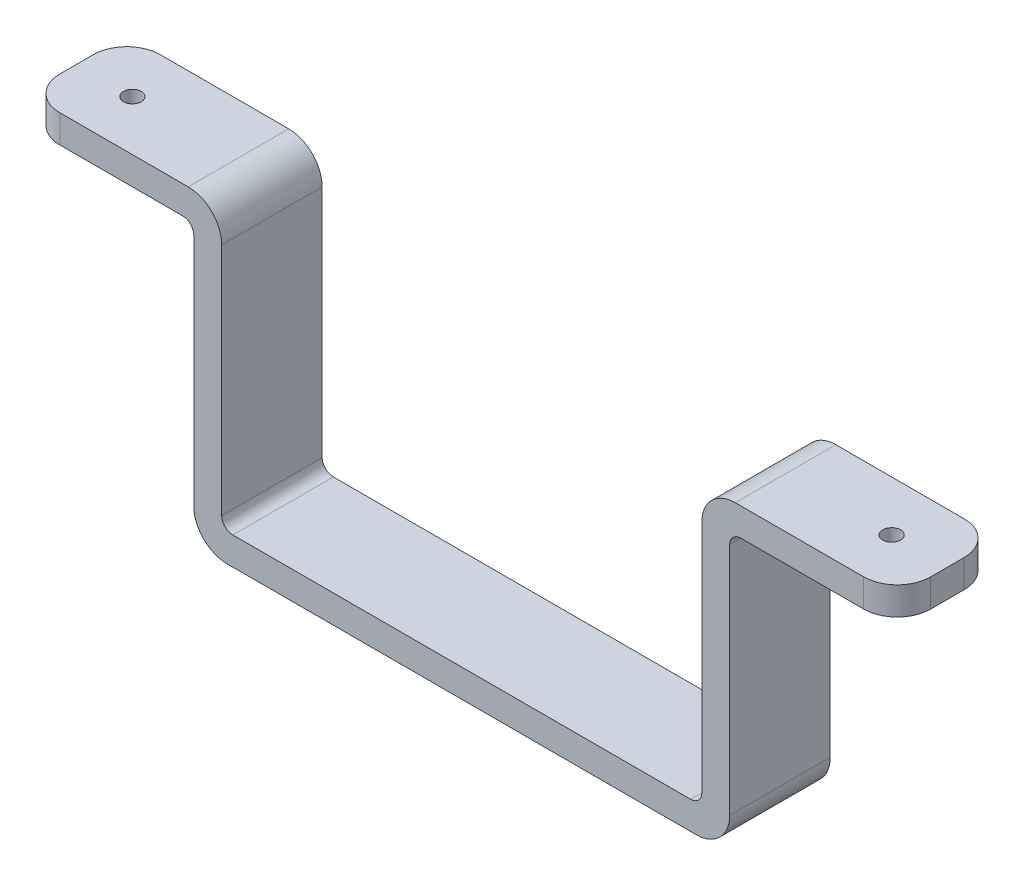
ISO-10303-21;
HEADER;
FILE_DESCRIPTION(('STEP AP214'),'2;1');
FILE_NAME('part.step','',(''),(''),'','','');
FILE_SCHEMA(('AUTOMOTIVE_DESIGN { 1 0 10303 214 1 1 1 1 }'));
ENDSEC;
DATA;
#1=APPLICATION_CONTEXT('core data for automotive mechanical design processes');
#2=APPLICATION_PROTOCOL_DEFINITION('international standard','automotive_design',2000,#1);
#3=PRODUCT_CONTEXT('',#1,'mechanical');
#4=PRODUCT('Part','Part','',(#3));
#5=PRODUCT_RELATED_PRODUCT_CATEGORY('part','',(#4));
#6=PRODUCT_DEFINITION_FORMATION('','',#4);
#7=PRODUCT_DEFINITION_CONTEXT('part definition',#1,'design');
#8=PRODUCT_DEFINITION('design','',#6,#7);
#9=PRODUCT_DEFINITION_SHAPE('','',#8);
#10=(LENGTH_UNIT() NAMED_UNIT(*) SI_UNIT(.MILLI.,.METRE.));
#11=(NAMED_UNIT(*) PLANE_ANGLE_UNIT() SI_UNIT($,.RADIAN.));
#12=(NAMED_UNIT(*) SI_UNIT($,.STERADIAN.) SOLID_ANGLE_UNIT());
#13=UNCERTAINTY_MEASURE_WITH_UNIT(LENGTH_MEASURE(1.E-05),#10,'distance_accuracy_value','');
#14=(GEOMETRIC_REPRESENTATION_CONTEXT(3) GLOBAL_UNCERTAINTY_ASSIGNED_CONTEXT((#13)) GLOBAL_UNIT_ASSIGNED_CONTEXT((#10,
#11,#12)) REPRESENTATION_CONTEXT('',''));
#15=CARTESIAN_POINT('',(0.,0.,0.));
#16=DIRECTION('',(0.,0.,1.));
#17=DIRECTION('',(1.,0.,0.));
#18=AXIS2_PLACEMENT_3D('',#15,#16,#17);
#19=CARTESIAN_POINT('',(-45.4805362921868,-17.3544151641239,9.));
#20=DIRECTION('',(0.,1.,0.));
#21=DIRECTION('',(0.,0.,1.));
#22=AXIS2_PLACEMENT_3D('',#19,#20,#21);
#23=PLANE('',#22);
#24=DIRECTION('',(1.,0.,0.));
#25=VECTOR('',#24,1.);
#26=CARTESIAN_POINT('',(-45.4805362921868,-17.3544151641239,0.));
#27=LINE('',#26,#25);
#28=CARTESIAN_POINT('',(-42.4805362921868,-17.3544151641239,0.));
#29=VERTEX_POINT('',#28);
#30=CARTESIAN_POINT('',(-0.480536292186792,-17.3544151641239,0.));
#31=VERTEX_POINT('',#30);
#32=EDGE_CURVE('E232',#29,#31,#27,.T.);
#33=ORIENTED_EDGE('',*,*,#32,.T.);
#34=DIRECTION('',(0.,0.,-1.));
#35=VECTOR('',#34,1.);
#36=CARTESIAN_POINT('',(-0.480536292186792,-17.3544151641239,9.));
#37=LINE('',#36,#35);
#38=CARTESIAN_POINT('',(-0.480536292186792,-17.3544151641239,9.));
#39=VERTEX_POINT('',#38);
#40=EDGE_CURVE('E328',#31,#39,#37,.F.);
#41=ORIENTED_EDGE('',*,*,#40,.T.);
#42=DIRECTION('',(1.,0.,0.));
#43=VECTOR('',#42,1.);
#44=CARTESIAN_POINT('',(-45.4805362921868,-17.3544151641239,9.));
#45=LINE('',#44,#43);
#46=CARTESIAN_POINT('',(-42.4805362921868,-17.3544151641239,9.));
#47=VERTEX_POINT('',#46);
#48=EDGE_CURVE('E250',#47,#39,#45,.T.);
#49=ORIENTED_EDGE('',*,*,#48,.F.);
#50=DIRECTION('',(0.,0.,-1.));
#51=VECTOR('',#50,1.);
#52=CARTESIAN_POINT('',(-42.4805362921868,-17.3544151641239,9.));
#53=LINE('',#52,#51);
#54=EDGE_CURVE('E325',#47,#29,#53,.T.);
#55=ORIENTED_EDGE('',*,*,#54,.T.);
#56=EDGE_LOOP('',(#33,#41,#49,#55));
#57=FACE_BOUND('',#56,.T.);
#58=ADVANCED_FACE('F37',(#57),#23,.F.);
#59=CARTESIAN_POINT('',(2.51946370781321,-17.3544151641239,9.));
#60=DIRECTION('',(-1.,0.,0.));
#61=DIRECTION('',(0.,0.,1.));
#62=AXIS2_PLACEMENT_3D('',#59,#60,#61);
#63=PLANE('',#62);
#64=DIRECTION('',(0.,1.,0.));
#65=VECTOR('',#64,1.);
#66=CARTESIAN_POINT('',(2.51946370781321,-17.3544151641239,9.));
#67=LINE('',#66,#65);
#68=CARTESIAN_POINT('',(2.51946370781321,-14.3544151641239,9.));
#69=VERTEX_POINT('',#68);
#70=CARTESIAN_POINT('',(2.51946370781321,6.6455848358761,9.));
#71=VERTEX_POINT('',#70);
#72=EDGE_CURVE('E408',#69,#71,#67,.T.);
#73=ORIENTED_EDGE('',*,*,#72,.F.);
#74=DIRECTION('',(0.,0.,-1.));
#75=VECTOR('',#74,1.);
#76=CARTESIAN_POINT('',(2.51946370781321,-14.3544151641239,9.));
#77=LINE('',#76,#75);
#78=CARTESIAN_POINT('',(2.51946370781321,-14.3544151641239,0.));
#79=VERTEX_POINT('',#78);
#80=EDGE_CURVE('E322',#69,#79,#77,.T.);
#81=ORIENTED_EDGE('',*,*,#80,.T.);
#82=DIRECTION('',(0.,1.,0.));
#83=VECTOR('',#82,1.);
#84=CARTESIAN_POINT('',(2.51946370781321,-17.3544151641239,0.));
#85=LINE('',#84,#83);
#86=CARTESIAN_POINT('',(2.51946370781321,6.6455848358761,0.));
#87=VERTEX_POINT('',#86);
#88=EDGE_CURVE('E228',#79,#87,#85,.T.);
#89=ORIENTED_EDGE('',*,*,#88,.T.);
#90=DIRECTION('',(0.,0.,-1.));
#91=VECTOR('',#90,1.);
#92=CARTESIAN_POINT('',(2.51946370781321,6.6455848358761,9.));
#93=LINE('',#92,#91);
#94=EDGE_CURVE('E205',#87,#71,#93,.F.);
#95=ORIENTED_EDGE('',*,*,#94,.T.);
#96=EDGE_LOOP('',(#73,#81,#89,#95));
#97=FACE_BOUND('',#96,.T.);
#98=ADVANCED_FACE('F456',(#97),#63,.F.);
#99=CARTESIAN_POINT('',(2.51946370781321,7.6455848358761,9.));
#100=DIRECTION('',(0.,1.,0.));
#101=DIRECTION('',(0.,0.,1.));
#102=AXIS2_PLACEMENT_3D('',#99,#100,#101);
#103=PLANE('',#102);
#104=CARTESIAN_POINT('',(12.5194637078132,7.6455848358761,4.5));
#105=DIRECTION('',(0.,1.,0.));
#106=DIRECTION('',(0.,0.,1.));
#107=AXIS2_PLACEMENT_3D('',#104,#105,#106);
#108=CIRCLE('',#107,0.799999999999996);
#109=CARTESIAN_POINT('',(12.5194637078132,7.6455848358761,5.3));
#110=VERTEX_POINT('',#109);
#111=EDGE_CURVE('E264',#110,#110,#108,.T.);
#112=ORIENTED_EDGE('',*,*,#111,.T.);
#113=EDGE_LOOP('',(#112));
#114=FACE_BOUND('',#113,.T.);
#115=DIRECTION('',(0.,0.,-1.));
#116=VECTOR('',#115,1.);
#117=CARTESIAN_POINT('',(17.5194637078132,7.6455848358761,9.));
#118=LINE('',#117,#116);
#119=CARTESIAN_POINT('',(17.5194637078132,7.6455848358761,6.));
#120=VERTEX_POINT('',#119);
#121=CARTESIAN_POINT('',(17.5194637078132,7.6455848358761,3.));
#122=VERTEX_POINT('',#121);
#123=EDGE_CURVE('E221',#120,#122,#118,.T.);
#124=ORIENTED_EDGE('',*,*,#123,.F.);
#125=CARTESIAN_POINT('',(14.5194637078132,7.6455848358761,6.));
#126=DIRECTION('',(0.,1.,0.));
#127=DIRECTION('',(0.,0.,1.));
#128=AXIS2_PLACEMENT_3D('',#125,#126,#127);
#129=CIRCLE('',#128,3.);
#130=CARTESIAN_POINT('',(14.5194637078132,7.6455848358761,9.));
#131=VERTEX_POINT('',#130);
#132=EDGE_CURVE('E354',#120,#131,#129,.F.);
#133=ORIENTED_EDGE('',*,*,#132,.T.);
#134=DIRECTION('',(1.,0.,0.));
#135=VECTOR('',#134,1.);
#136=CARTESIAN_POINT('',(2.51946370781321,7.6455848358761,9.));
#137=LINE('',#136,#135);
#138=CARTESIAN_POINT('',(3.51946370781321,7.6455848358761,9.));
#139=VERTEX_POINT('',#138);
#140=EDGE_CURVE('E220',#139,#131,#137,.T.);
#141=ORIENTED_EDGE('',*,*,#140,.F.);
#142=DIRECTION('',(0.,0.,-1.));
#143=VECTOR('',#142,1.);
#144=CARTESIAN_POINT('',(3.51946370781321,7.6455848358761,0.));
#145=LINE('',#144,#143);
#146=CARTESIAN_POINT('',(3.51946370781321,7.6455848358761,0.));
#147=VERTEX_POINT('',#146);
#148=EDGE_CURVE('E203',#139,#147,#145,.T.);
#149=ORIENTED_EDGE('',*,*,#148,.T.);
#150=DIRECTION('',(1.,0.,0.));
#151=VECTOR('',#150,1.);
#152=CARTESIAN_POINT('',(2.51946370781321,7.6455848358761,0.));
#153=LINE('',#152,#151);
#154=CARTESIAN_POINT('',(14.5194637078132,7.6455848358761,0.));
#155=VERTEX_POINT('',#154);
#156=EDGE_CURVE('E217',#147,#155,#153,.T.);
#157=ORIENTED_EDGE('',*,*,#156,.T.);
#158=CARTESIAN_POINT('',(14.5194637078132,7.6455848358761,3.));
#159=DIRECTION('',(0.,1.,0.));
#160=DIRECTION('',(0.,0.,1.));
#161=AXIS2_PLACEMENT_3D('',#158,#159,#160);
#162=CIRCLE('',#161,3.);
#163=EDGE_CURVE('E352',#155,#122,#162,.F.);
#164=ORIENTED_EDGE('',*,*,#163,.T.);
#165=EDGE_LOOP('',(#124,#133,#141,#149,#157,#164));
#166=FACE_BOUND('',#165,.T.);
#167=ADVANCED_FACE('F216',(#114,#166),#103,.F.);
#168=CARTESIAN_POINT('',(17.5194637078132,7.6455848358761,9.));
#169=DIRECTION('',(-1.,0.,0.));
#170=DIRECTION('',(0.,0.,1.));
#171=AXIS2_PLACEMENT_3D('',#168,#169,#170);
#172=PLANE('',#171);
#173=DIRECTION('',(0.,0.,-1.));
#174=VECTOR('',#173,1.);
#175=CARTESIAN_POINT('',(17.5194637078132,10.1455848358761,9.));
#176=LINE('',#175,#174);
#177=CARTESIAN_POINT('',(17.5194637078132,10.1455848358761,6.));
#178=VERTEX_POINT('',#177);
#179=CARTESIAN_POINT('',(17.5194637078132,10.1455848358761,3.));
#180=VERTEX_POINT('',#179);
#181=EDGE_CURVE('E257',#178,#180,#176,.T.);
#182=ORIENTED_EDGE('',*,*,#181,.F.);
#183=DIRECTION('',(0.,1.,0.));
#184=VECTOR('',#183,1.);
#185=CARTESIAN_POINT('',(17.5194637078132,7.6455848358761,6.));
#186=LINE('',#185,#184);
#187=EDGE_CURVE('E350',#178,#120,#186,.F.);
#188=ORIENTED_EDGE('',*,*,#187,.T.);
#189=ORIENTED_EDGE('',*,*,#123,.T.);
#190=DIRECTION('',(0.,1.,0.));
#191=VECTOR('',#190,1.);
#192=CARTESIAN_POINT('',(17.5194637078132,7.6455848358761,3.));
#193=LINE('',#192,#191);
#194=EDGE_CURVE('E347',#122,#180,#193,.T.);
#195=ORIENTED_EDGE('',*,*,#194,.T.);
#196=EDGE_LOOP('',(#182,#188,#189,#195));
#197=FACE_BOUND('',#196,.T.);
#198=ADVANCED_FACE('F467',(#197),#172,.F.);
#199=CARTESIAN_POINT('',(0.0194637078132103,10.1455848358761,9.));
#200=DIRECTION('',(0.,-1.,0.));
#201=DIRECTION('',(1.,0.,0.));
#202=AXIS2_PLACEMENT_3D('',#199,#200,#201);
#203=PLANE('',#202);
#204=CARTESIAN_POINT('',(12.5194637078132,10.1455848358761,4.5));
#205=DIRECTION('',(0.,1.,0.));
#206=DIRECTION('',(0.,0.,-1.));
#207=AXIS2_PLACEMENT_3D('',#204,#205,#206);
#208=CIRCLE('',#207,0.799999999999996);
#209=CARTESIAN_POINT('',(12.5194637078132,10.1455848358761,3.7));
#210=VERTEX_POINT('',#209);
#211=EDGE_CURVE('E404',#210,#210,#208,.T.);
#212=ORIENTED_EDGE('',*,*,#211,.F.);
#213=EDGE_LOOP('',(#212));
#214=FACE_BOUND('',#213,.T.);
#215=DIRECTION('',(-1.,0.,0.));
#216=VECTOR('',#215,1.);
#217=CARTESIAN_POINT('',(0.0194637078132103,10.1455848358761,9.));
#218=LINE('',#217,#216);
#219=CARTESIAN_POINT('',(14.5194637078132,10.1455848358761,9.));
#220=VERTEX_POINT('',#219);
#221=CARTESIAN_POINT('',(3.01946370781321,10.1455848358761,9.));
#222=VERTEX_POINT('',#221);
#223=EDGE_CURVE('E411',#220,#222,#218,.T.);
#224=ORIENTED_EDGE('',*,*,#223,.F.);
#225=CARTESIAN_POINT('',(14.5194637078132,10.1455848358761,6.));
#226=DIRECTION('',(0.,-1.,0.));
#227=DIRECTION('',(1.,0.,0.));
#228=AXIS2_PLACEMENT_3D('',#225,#226,#227);
#229=CIRCLE('',#228,3.);
#230=EDGE_CURVE('E345',#220,#178,#229,.F.);
#231=ORIENTED_EDGE('',*,*,#230,.T.);
#232=ORIENTED_EDGE('',*,*,#181,.T.);
#233=CARTESIAN_POINT('',(14.5194637078132,10.1455848358761,3.));
#234=DIRECTION('',(0.,-1.,0.));
#235=DIRECTION('',(1.,0.,0.));
#236=AXIS2_PLACEMENT_3D('',#233,#234,#235);
#237=CIRCLE('',#236,3.);
#238=CARTESIAN_POINT('',(14.5194637078132,10.1455848358761,0.));
#239=VERTEX_POINT('',#238);
#240=EDGE_CURVE('E343',#180,#239,#237,.F.);
#241=ORIENTED_EDGE('',*,*,#240,.T.);
#242=DIRECTION('',(-1.,0.,0.));
#243=VECTOR('',#242,1.);
#244=CARTESIAN_POINT('',(0.0194637078132103,10.1455848358761,0.));
#245=LINE('',#244,#243);
#246=CARTESIAN_POINT('',(3.01946370781321,10.1455848358761,0.));
#247=VERTEX_POINT('',#246);
#248=EDGE_CURVE('E227',#239,#247,#245,.T.);
#249=ORIENTED_EDGE('',*,*,#248,.T.);
#250=DIRECTION('',(0.,0.,-1.));
#251=VECTOR('',#250,1.);
#252=CARTESIAN_POINT('',(3.01946370781321,10.1455848358761,9.));
#253=LINE('',#252,#251);
#254=EDGE_CURVE('E311',#247,#222,#253,.F.);
#255=ORIENTED_EDGE('',*,*,#254,.T.);
#256=EDGE_LOOP('',(#224,#231,#232,#241,#249,#255));
#257=FACE_BOUND('',#256,.T.);
#258=ADVANCED_FACE('F465',(#214,#257),#203,.F.);
#259=CARTESIAN_POINT('',(0.0194637078132082,-14.8544151641239,9.));
#260=DIRECTION('',(1.,0.,0.));
#261=DIRECTION('',(0.,1.,0.));
#262=AXIS2_PLACEMENT_3D('',#259,#260,#261);
#263=PLANE('',#262);
#264=DIRECTION('',(0.,-1.,0.));
#265=VECTOR('',#264,1.);
#266=CARTESIAN_POINT('',(0.0194637078132082,-14.8544151641239,9.));
#267=LINE('',#266,#265);
#268=CARTESIAN_POINT('',(0.0194637078132101,7.1455848358761,9.));
#269=VERTEX_POINT('',#268);
#270=CARTESIAN_POINT('',(0.0194637078132083,-13.8544151641239,9.));
#271=VERTEX_POINT('',#270);
#272=EDGE_CURVE('E413',#269,#271,#267,.T.);
#273=ORIENTED_EDGE('',*,*,#272,.F.);
#274=DIRECTION('',(0.,0.,-1.));
#275=VECTOR('',#274,1.);
#276=CARTESIAN_POINT('',(0.0194637078132101,7.1455848358761,9.));
#277=LINE('',#276,#275);
#278=CARTESIAN_POINT('',(0.0194637078132101,7.1455848358761,0.));
#279=VERTEX_POINT('',#278);
#280=EDGE_CURVE('E299',#269,#279,#277,.T.);
#281=ORIENTED_EDGE('',*,*,#280,.T.);
#282=DIRECTION('',(0.,-1.,0.));
#283=VECTOR('',#282,1.);
#284=CARTESIAN_POINT('',(0.0194637078132082,-14.8544151641239,0.));
#285=LINE('',#284,#283);
#286=CARTESIAN_POINT('',(0.0194637078132083,-13.8544151641239,0.));
#287=VERTEX_POINT('',#286);
#288=EDGE_CURVE('E230',#279,#287,#285,.T.);
#289=ORIENTED_EDGE('',*,*,#288,.T.);
#290=DIRECTION('',(0.,0.,-1.));
#291=VECTOR('',#290,1.);
#292=CARTESIAN_POINT('',(0.0194637078132083,-13.8544151641239,9.));
#293=LINE('',#292,#291);
#294=EDGE_CURVE('E273',#287,#271,#293,.F.);
#295=ORIENTED_EDGE('',*,*,#294,.T.);
#296=EDGE_LOOP('',(#273,#281,#289,#295));
#297=FACE_BOUND('',#296,.T.);
#298=ADVANCED_FACE('F479',(#297),#263,.F.);
#299=CARTESIAN_POINT('',(-42.9805362921868,-14.8544151641239,9.));
#300=DIRECTION('',(0.,-1.,0.));
#301=DIRECTION('',(0.,0.,-1.));
#302=AXIS2_PLACEMENT_3D('',#299,#300,#301);
#303=PLANE('',#302);
#304=DIRECTION('',(-1.,0.,0.));
#305=VECTOR('',#304,1.);
#306=CARTESIAN_POINT('',(-42.9805362921868,-14.8544151641239,9.));
#307=LINE('',#306,#305);
#308=CARTESIAN_POINT('',(-0.980536292186793,-14.8544151641239,9.));
#309=VERTEX_POINT('',#308);
#310=CARTESIAN_POINT('',(-41.9805362921868,-14.8544151641239,9.));
#311=VERTEX_POINT('',#310);
#312=EDGE_CURVE('E389',#309,#311,#307,.T.);
#313=ORIENTED_EDGE('',*,*,#312,.F.);
#314=DIRECTION('',(0.,0.,-1.));
#315=VECTOR('',#314,1.);
#316=CARTESIAN_POINT('',(-0.980536292186793,-14.8544151641239,0.));
#317=LINE('',#316,#315);
#318=CARTESIAN_POINT('',(-0.980536292186793,-14.8544151641239,0.));
#319=VERTEX_POINT('',#318);
#320=EDGE_CURVE('E270',#309,#319,#317,.T.);
#321=ORIENTED_EDGE('',*,*,#320,.T.);
#322=DIRECTION('',(-1.,0.,0.));
#323=VECTOR('',#322,1.);
#324=CARTESIAN_POINT('',(-42.9805362921868,-14.8544151641239,0.));
#325=LINE('',#324,#323);
#326=CARTESIAN_POINT('',(-41.9805362921868,-14.8544151641239,0.));
#327=VERTEX_POINT('',#326);
#328=EDGE_CURVE('E237',#319,#327,#325,.T.);
#329=ORIENTED_EDGE('',*,*,#328,.T.);
#330=DIRECTION('',(0.,0.,-1.));
#331=VECTOR('',#330,1.);
#332=CARTESIAN_POINT('',(-41.9805362921868,-14.8544151641239,9.));
#333=LINE('',#332,#331);
#334=EDGE_CURVE('E268',#327,#311,#333,.F.);
#335=ORIENTED_EDGE('',*,*,#334,.T.);
#336=EDGE_LOOP('',(#313,#321,#329,#335));
#337=FACE_BOUND('',#336,.T.);
#338=ADVANCED_FACE('F483',(#337),#303,.F.);
#339=CARTESIAN_POINT('',(-42.9805362921868,-14.8544151641239,9.));
#340=DIRECTION('',(-1.,0.,0.));
#341=DIRECTION('',(0.,0.,1.));
#342=AXIS2_PLACEMENT_3D('',#339,#340,#341);
#343=PLANE('',#342);
#344=DIRECTION('',(0.,1.,0.));
#345=VECTOR('',#344,1.);
#346=CARTESIAN_POINT('',(-42.9805362921868,-14.8544151641239,0.));
#347=LINE('',#346,#345);
#348=CARTESIAN_POINT('',(-42.9805362921868,-13.8544151641239,0.));
#349=VERTEX_POINT('',#348);
#350=CARTESIAN_POINT('',(-42.9805362921868,7.1455848358761,0.));
#351=VERTEX_POINT('',#350);
#352=EDGE_CURVE('E240',#349,#351,#347,.T.);
#353=ORIENTED_EDGE('',*,*,#352,.T.);
#354=DIRECTION('',(0.,0.,-1.));
#355=VECTOR('',#354,1.);
#356=CARTESIAN_POINT('',(-42.9805362921868,7.14558483587611,9.));
#357=LINE('',#356,#355);
#358=CARTESIAN_POINT('',(-42.9805362921868,7.1455848358761,9.));
#359=VERTEX_POINT('',#358);
#360=EDGE_CURVE('E335',#351,#359,#357,.F.);
#361=ORIENTED_EDGE('',*,*,#360,.T.);
#362=DIRECTION('',(0.,1.,0.));
#363=VECTOR('',#362,1.);
#364=CARTESIAN_POINT('',(-42.9805362921868,-14.8544151641239,9.));
#365=LINE('',#364,#363);
#366=CARTESIAN_POINT('',(-42.9805362921868,-13.8544151641239,9.));
#367=VERTEX_POINT('',#366);
#368=EDGE_CURVE('E386',#367,#359,#365,.T.);
#369=ORIENTED_EDGE('',*,*,#368,.F.);
#370=DIRECTION('',(0.,0.,-1.));
#371=VECTOR('',#370,1.);
#372=CARTESIAN_POINT('',(-42.9805362921868,-13.8544151641239,0.));
#373=LINE('',#372,#371);
#374=EDGE_CURVE('E276',#367,#349,#373,.T.);
#375=ORIENTED_EDGE('',*,*,#374,.T.);
#376=EDGE_LOOP('',(#353,#361,#369,#375));
#377=FACE_BOUND('',#376,.T.);
#378=ADVANCED_FACE('F427',(#377),#343,.F.);
#379=CARTESIAN_POINT('',(-60.4805362921868,10.1455848358761,9.));
#380=DIRECTION('',(0.,-1.,0.));
#381=DIRECTION('',(0.,0.,-1.));
#382=AXIS2_PLACEMENT_3D('',#379,#380,#381);
#383=PLANE('',#382);
#384=CARTESIAN_POINT('',(-55.4805362921868,10.1455848358761,4.5));
#385=DIRECTION('',(0.,1.,0.));
#386=DIRECTION('',(0.,0.,1.));
#387=AXIS2_PLACEMENT_3D('',#384,#385,#386);
#388=CIRCLE('',#387,0.799999999999996);
#389=CARTESIAN_POINT('',(-55.4805362921868,10.1455848358761,5.3));
#390=VERTEX_POINT('',#389);
#391=EDGE_CURVE('E265',#390,#390,#388,.T.);
#392=ORIENTED_EDGE('',*,*,#391,.F.);
#393=EDGE_LOOP('',(#392));
#394=FACE_BOUND('',#393,.T.);
#395=DIRECTION('',(0.,0.,-1.));
#396=VECTOR('',#395,1.);
#397=CARTESIAN_POINT('',(-60.4805362921868,10.1455848358761,9.));
#398=LINE('',#397,#396);
#399=CARTESIAN_POINT('',(-60.4805362921868,10.1455848358761,6.));
#400=VERTEX_POINT('',#399);
#401=CARTESIAN_POINT('',(-60.4805362921868,10.1455848358761,3.));
#402=VERTEX_POINT('',#401);
#403=EDGE_CURVE('E254',#400,#402,#398,.T.);
#404=ORIENTED_EDGE('',*,*,#403,.F.);
#405=CARTESIAN_POINT('',(-57.4805362921868,10.1455848358761,6.));
#406=DIRECTION('',(0.,-1.,0.));
#407=DIRECTION('',(0.,0.,-1.));
#408=AXIS2_PLACEMENT_3D('',#405,#406,#407);
#409=CIRCLE('',#408,3.);
#410=CARTESIAN_POINT('',(-57.4805362921868,10.1455848358761,9.));
#411=VERTEX_POINT('',#410);
#412=EDGE_CURVE('E11',#400,#411,#409,.F.);
#413=ORIENTED_EDGE('',*,*,#412,.T.);
#414=DIRECTION('',(-1.,0.,0.));
#415=VECTOR('',#414,1.);
#416=CARTESIAN_POINT('',(-60.4805362921868,10.1455848358761,9.));
#417=LINE('',#416,#415);
#418=CARTESIAN_POINT('',(-45.9805362921868,10.1455848358761,9.));
#419=VERTEX_POINT('',#418);
#420=EDGE_CURVE('E382',#419,#411,#417,.T.);
#421=ORIENTED_EDGE('',*,*,#420,.F.);
#422=DIRECTION('',(0.,0.,-1.));
#423=VECTOR('',#422,1.);
#424=CARTESIAN_POINT('',(-45.9805362921868,10.1455848358761,9.));
#425=LINE('',#424,#423);
#426=CARTESIAN_POINT('',(-45.9805362921868,10.1455848358761,0.));
#427=VERTEX_POINT('',#426);
#428=EDGE_CURVE('E332',#419,#427,#425,.T.);
#429=ORIENTED_EDGE('',*,*,#428,.T.);
#430=DIRECTION('',(-1.,0.,0.));
#431=VECTOR('',#430,1.);
#432=CARTESIAN_POINT('',(-60.4805362921868,10.1455848358761,0.));
#433=LINE('',#432,#431);
#434=CARTESIAN_POINT('',(-57.4805362921868,10.1455848358761,0.));
#435=VERTEX_POINT('',#434);
#436=EDGE_CURVE('E243',#427,#435,#433,.T.);
#437=ORIENTED_EDGE('',*,*,#436,.T.);
#438=CARTESIAN_POINT('',(-57.4805362921868,10.1455848358761,3.));
#439=DIRECTION('',(0.,-1.,0.));
#440=DIRECTION('',(0.,0.,-1.));
#441=AXIS2_PLACEMENT_3D('',#438,#439,#440);
#442=CIRCLE('',#441,3.);
#443=EDGE_CURVE('E45',#435,#402,#442,.F.);
#444=ORIENTED_EDGE('',*,*,#443,.T.);
#445=EDGE_LOOP('',(#404,#413,#421,#429,#437,#444));
#446=FACE_BOUND('',#445,.T.);
#447=ADVANCED_FACE('F433',(#394,#446),#383,.F.);
#448=CARTESIAN_POINT('',(-60.4805362921868,10.1455848358761,9.));
#449=DIRECTION('',(1.,0.,0.));
#450=DIRECTION('',(0.,0.,-1.));
#451=AXIS2_PLACEMENT_3D('',#448,#449,#450);
#452=PLANE('',#451);
#453=DIRECTION('',(0.,0.,-1.));
#454=VECTOR('',#453,1.);
#455=CARTESIAN_POINT('',(-60.4805362921868,7.6455848358761,9.));
#456=LINE('',#455,#454);
#457=CARTESIAN_POINT('',(-60.4805362921868,7.6455848358761,6.));
#458=VERTEX_POINT('',#457);
#459=CARTESIAN_POINT('',(-60.4805362921868,7.6455848358761,3.));
#460=VERTEX_POINT('',#459);
#461=EDGE_CURVE('E251',#458,#460,#456,.T.);
#462=ORIENTED_EDGE('',*,*,#461,.F.);
#463=DIRECTION('',(0.,-1.,0.));
#464=VECTOR('',#463,1.);
#465=CARTESIAN_POINT('',(-60.4805362921868,10.1455848358761,6.));
#466=LINE('',#465,#464);
#467=EDGE_CURVE('E58',#458,#400,#466,.F.);
#468=ORIENTED_EDGE('',*,*,#467,.T.);
#469=ORIENTED_EDGE('',*,*,#403,.T.);
#470=DIRECTION('',(0.,-1.,0.));
#471=VECTOR('',#470,1.);
#472=CARTESIAN_POINT('',(-60.4805362921868,10.1455848358761,3.));
#473=LINE('',#472,#471);
#474=EDGE_CURVE('E363',#402,#460,#473,.T.);
#475=ORIENTED_EDGE('',*,*,#474,.T.);
#476=EDGE_LOOP('',(#462,#468,#469,#475));
#477=FACE_BOUND('',#476,.T.);
#478=ADVANCED_FACE('F367',(#477),#452,.F.);
#479=CARTESIAN_POINT('',(-60.4805362921868,7.6455848358761,9.));
#480=DIRECTION('',(0.,1.,0.));
#481=DIRECTION('',(0.,0.,1.));
#482=AXIS2_PLACEMENT_3D('',#479,#480,#481);
#483=PLANE('',#482);
#484=CARTESIAN_POINT('',(-55.4805362921868,7.6455848358761,4.5));
#485=DIRECTION('',(0.,1.,0.));
#486=DIRECTION('',(0.,0.,1.));
#487=AXIS2_PLACEMENT_3D('',#484,#485,#486);
#488=CIRCLE('',#487,0.799999999999996);
#489=CARTESIAN_POINT('',(-55.4805362921868,7.6455848358761,5.3));
#490=VERTEX_POINT('',#489);
#491=EDGE_CURVE('E262',#490,#490,#488,.T.);
#492=ORIENTED_EDGE('',*,*,#491,.T.);
#493=EDGE_LOOP('',(#492));
#494=FACE_BOUND('',#493,.T.);
#495=DIRECTION('',(1.,0.,0.));
#496=VECTOR('',#495,1.);
#497=CARTESIAN_POINT('',(-60.4805362921868,7.6455848358761,9.));
#498=LINE('',#497,#496);
#499=CARTESIAN_POINT('',(-57.4805362921868,7.6455848358761,9.));
#500=VERTEX_POINT('',#499);
#501=CARTESIAN_POINT('',(-46.4805362921868,7.6455848358761,9.));
#502=VERTEX_POINT('',#501);
#503=EDGE_CURVE('E373',#500,#502,#498,.T.);
#504=ORIENTED_EDGE('',*,*,#503,.F.);
#505=CARTESIAN_POINT('',(-57.4805362921868,7.6455848358761,6.));
#506=DIRECTION('',(0.,1.,0.));
#507=DIRECTION('',(0.,0.,1.));
#508=AXIS2_PLACEMENT_3D('',#505,#506,#507);
#509=CIRCLE('',#508,3.);
#510=EDGE_CURVE('E361',#500,#458,#509,.F.);
#511=ORIENTED_EDGE('',*,*,#510,.T.);
#512=ORIENTED_EDGE('',*,*,#461,.T.);
#513=CARTESIAN_POINT('',(-57.4805362921868,7.6455848358761,3.));
#514=DIRECTION('',(0.,1.,0.));
#515=DIRECTION('',(0.,0.,1.));
#516=AXIS2_PLACEMENT_3D('',#513,#514,#515);
#517=CIRCLE('',#516,3.);
#518=CARTESIAN_POINT('',(-57.4805362921868,7.6455848358761,0.));
#519=VERTEX_POINT('',#518);
#520=EDGE_CURVE('E359',#460,#519,#517,.F.);
#521=ORIENTED_EDGE('',*,*,#520,.T.);
#522=DIRECTION('',(1.,0.,0.));
#523=VECTOR('',#522,1.);
#524=CARTESIAN_POINT('',(-60.4805362921868,7.6455848358761,0.));
#525=LINE('',#524,#523);
#526=CARTESIAN_POINT('',(-46.4805362921868,7.6455848358761,0.));
#527=VERTEX_POINT('',#526);
#528=EDGE_CURVE('E245',#519,#527,#525,.T.);
#529=ORIENTED_EDGE('',*,*,#528,.T.);
#530=DIRECTION('',(0.,0.,-1.));
#531=VECTOR('',#530,1.);
#532=CARTESIAN_POINT('',(-46.4805362921868,7.6455848358761,9.));
#533=LINE('',#532,#531);
#534=EDGE_CURVE('E210',#527,#502,#533,.F.);
#535=ORIENTED_EDGE('',*,*,#534,.T.);
#536=EDGE_LOOP('',(#504,#511,#512,#521,#529,#535));
#537=FACE_BOUND('',#536,.T.);
#538=ADVANCED_FACE('F371',(#494,#537),#483,.F.);
#539=CARTESIAN_POINT('',(-45.4805362921868,-17.3544151641239,9.));
#540=DIRECTION('',(1.,0.,0.));
#541=DIRECTION('',(0.,0.,-1.));
#542=AXIS2_PLACEMENT_3D('',#539,#540,#541);
#543=PLANE('',#542);
#544=DIRECTION('',(0.,-1.,0.));
#545=VECTOR('',#544,1.);
#546=CARTESIAN_POINT('',(-45.4805362921868,-17.3544151641239,0.));
#547=LINE('',#546,#545);
#548=CARTESIAN_POINT('',(-45.4805362921868,6.6455848358761,0.));
#549=VERTEX_POINT('',#548);
#550=CARTESIAN_POINT('',(-45.4805362921868,-14.3544151641239,0.));
#551=VERTEX_POINT('',#550);
#552=EDGE_CURVE('E247',#549,#551,#547,.T.);
#553=ORIENTED_EDGE('',*,*,#552,.T.);
#554=DIRECTION('',(0.,0.,-1.));
#555=VECTOR('',#554,1.);
#556=CARTESIAN_POINT('',(-45.4805362921868,-14.3544151641239,9.));
#557=LINE('',#556,#555);
#558=CARTESIAN_POINT('',(-45.4805362921868,-14.3544151641239,9.));
#559=VERTEX_POINT('',#558);
#560=EDGE_CURVE('E330',#551,#559,#557,.F.);
#561=ORIENTED_EDGE('',*,*,#560,.T.);
#562=DIRECTION('',(0.,-1.,0.));
#563=VECTOR('',#562,1.);
#564=CARTESIAN_POINT('',(-45.4805362921868,-17.3544151641239,9.));
#565=LINE('',#564,#563);
#566=CARTESIAN_POINT('',(-45.4805362921868,6.6455848358761,9.));
#567=VERTEX_POINT('',#566);
#568=EDGE_CURVE('E255',#567,#559,#565,.T.);
#569=ORIENTED_EDGE('',*,*,#568,.F.);
#570=DIRECTION('',(0.,0.,-1.));
#571=VECTOR('',#570,1.);
#572=CARTESIAN_POINT('',(-45.4805362921868,6.6455848358761,0.));
#573=LINE('',#572,#571);
#574=EDGE_CURVE('E279',#567,#549,#573,.T.);
#575=ORIENTED_EDGE('',*,*,#574,.T.);
#576=EDGE_LOOP('',(#553,#561,#569,#575));
#577=FACE_BOUND('',#576,.T.);
#578=ADVANCED_FACE('F444',(#577),#543,.F.);
#579=CARTESIAN_POINT('',(0.,0.,9.));
#580=DIRECTION('',(0.,0.,1.));
#581=DIRECTION('',(1.,0.,0.));
#582=AXIS2_PLACEMENT_3D('',#579,#580,#581);
#583=PLANE('',#582);
#584=ORIENTED_EDGE('',*,*,#140,.T.);
#585=DIRECTION('',(0.,1.,0.));
#586=VECTOR('',#585,1.);
#587=CARTESIAN_POINT('',(14.5194637078132,10.1455848358761,9.));
#588=LINE('',#587,#586);
#589=EDGE_CURVE('E340',#131,#220,#588,.T.);
#590=ORIENTED_EDGE('',*,*,#589,.T.);
#591=ORIENTED_EDGE('',*,*,#223,.T.);
#592=CARTESIAN_POINT('',(3.01946370781321,7.1455848358761,9.));
#593=DIRECTION('',(0.,0.,1.));
#594=DIRECTION('',(1.,0.,0.));
#595=AXIS2_PLACEMENT_3D('',#592,#593,#594);
#596=CIRCLE('',#595,3.);
#597=EDGE_CURVE('E320',#222,#269,#596,.T.);
#598=ORIENTED_EDGE('',*,*,#597,.T.);
#599=ORIENTED_EDGE('',*,*,#272,.T.);
#600=CARTESIAN_POINT('',(-0.980536292186793,-13.8544151641239,9.));
#601=DIRECTION('',(0.,0.,1.));
#602=DIRECTION('',(1.,0.,0.));
#603=AXIS2_PLACEMENT_3D('',#600,#601,#602);
#604=CIRCLE('',#603,1.);
#605=EDGE_CURVE('E288',#271,#309,#604,.F.);
#606=ORIENTED_EDGE('',*,*,#605,.T.);
#607=ORIENTED_EDGE('',*,*,#312,.T.);
#608=CARTESIAN_POINT('',(-41.9805362921868,-13.8544151641239,9.));
#609=DIRECTION('',(0.,0.,1.));
#610=DIRECTION('',(1.,0.,0.));
#611=AXIS2_PLACEMENT_3D('',#608,#609,#610);
#612=CIRCLE('',#611,1.);
#613=EDGE_CURVE('E292',#311,#367,#612,.F.);
#614=ORIENTED_EDGE('',*,*,#613,.T.);
#615=ORIENTED_EDGE('',*,*,#368,.T.);
#616=CARTESIAN_POINT('',(-45.9805362921868,7.14558483587611,9.));
#617=DIRECTION('',(0.,0.,1.));
#618=DIRECTION('',(1.,0.,0.));
#619=AXIS2_PLACEMENT_3D('',#616,#617,#618);
#620=CIRCLE('',#619,3.);
#621=EDGE_CURVE('E314',#359,#419,#620,.T.);
#622=ORIENTED_EDGE('',*,*,#621,.T.);
#623=ORIENTED_EDGE('',*,*,#420,.T.);
#624=DIRECTION('',(0.,-1.,0.));
#625=VECTOR('',#624,1.);
#626=CARTESIAN_POINT('',(-57.4805362921868,7.6455848358761,9.));
#627=LINE('',#626,#625);
#628=EDGE_CURVE('E337',#411,#500,#627,.T.);
#629=ORIENTED_EDGE('',*,*,#628,.T.);
#630=ORIENTED_EDGE('',*,*,#503,.T.);
#631=CARTESIAN_POINT('',(-46.4805362921868,6.6455848358761,9.));
#632=DIRECTION('',(0.,0.,1.));
#633=DIRECTION('',(1.,0.,0.));
#634=AXIS2_PLACEMENT_3D('',#631,#632,#633);
#635=CIRCLE('',#634,1.);
#636=EDGE_CURVE('E297',#502,#567,#635,.F.);
#637=ORIENTED_EDGE('',*,*,#636,.T.);
#638=ORIENTED_EDGE('',*,*,#568,.T.);
#639=CARTESIAN_POINT('',(-42.4805362921868,-14.3544151641239,9.));
#640=DIRECTION('',(0.,0.,1.));
#641=DIRECTION('',(1.,0.,0.));
#642=AXIS2_PLACEMENT_3D('',#639,#640,#641);
#643=CIRCLE('',#642,3.);
#644=EDGE_CURVE('E316',#559,#47,#643,.T.);
#645=ORIENTED_EDGE('',*,*,#644,.T.);
#646=ORIENTED_EDGE('',*,*,#48,.T.);
#647=CARTESIAN_POINT('',(-0.48053629218679,-14.3544151641239,9.));
#648=DIRECTION('',(0.,0.,1.));
#649=DIRECTION('',(1.,0.,0.));
#650=AXIS2_PLACEMENT_3D('',#647,#648,#649);
#651=CIRCLE('',#650,3.);
#652=EDGE_CURVE('E318',#39,#69,#651,.T.);
#653=ORIENTED_EDGE('',*,*,#652,.T.);
#654=ORIENTED_EDGE('',*,*,#72,.T.);
#655=CARTESIAN_POINT('',(3.51946370781321,6.6455848358761,9.));
#656=DIRECTION('',(0.,0.,1.));
#657=DIRECTION('',(1.,0.,0.));
#658=AXIS2_PLACEMENT_3D('',#655,#656,#657);
#659=CIRCLE('',#658,1.);
#660=EDGE_CURVE('E209',#71,#139,#659,.F.);
#661=ORIENTED_EDGE('',*,*,#660,.T.);
#662=EDGE_LOOP('',(#584,#590,#591,#598,#599,#606,#607,#614,#615,#622,#623,#629,#630,#637,#638,
#645,#646,#653,#654,#661));
#663=FACE_BOUND('',#662,.T.);
#664=ADVANCED_FACE('F380',(#663),#583,.T.);
#665=CARTESIAN_POINT('',(0.,0.,0.));
#666=DIRECTION('',(0.,0.,1.));
#667=DIRECTION('',(1.,0.,0.));
#668=AXIS2_PLACEMENT_3D('',#665,#666,#667);
#669=PLANE('',#668);
#670=ORIENTED_EDGE('',*,*,#248,.F.);
#671=DIRECTION('',(0.,1.,0.));
#672=VECTOR('',#671,1.);
#673=CARTESIAN_POINT('',(14.5194637078132,0.,0.));
#674=LINE('',#673,#672);
#675=EDGE_CURVE('E226',#239,#155,#674,.F.);
#676=ORIENTED_EDGE('',*,*,#675,.T.);
#677=ORIENTED_EDGE('',*,*,#156,.F.);
#678=CARTESIAN_POINT('',(3.51946370781321,6.6455848358761,0.));
#679=DIRECTION('',(0.,0.,1.));
#680=DIRECTION('',(1.,0.,0.));
#681=AXIS2_PLACEMENT_3D('',#678,#679,#680);
#682=CIRCLE('',#681,1.);
#683=EDGE_CURVE('E199',#147,#87,#682,.T.);
#684=ORIENTED_EDGE('',*,*,#683,.T.);
#685=ORIENTED_EDGE('',*,*,#88,.F.);
#686=CARTESIAN_POINT('',(-0.48053629218679,-14.3544151641239,0.));
#687=DIRECTION('',(0.,0.,1.));
#688=DIRECTION('',(1.,0.,0.));
#689=AXIS2_PLACEMENT_3D('',#686,#687,#688);
#690=CIRCLE('',#689,3.);
#691=EDGE_CURVE('E306',#79,#31,#690,.F.);
#692=ORIENTED_EDGE('',*,*,#691,.T.);
#693=ORIENTED_EDGE('',*,*,#32,.F.);
#694=CARTESIAN_POINT('',(-42.4805362921868,-14.3544151641239,0.));
#695=DIRECTION('',(0.,0.,1.));
#696=DIRECTION('',(1.,0.,0.));
#697=AXIS2_PLACEMENT_3D('',#694,#695,#696);
#698=CIRCLE('',#697,3.);
#699=EDGE_CURVE('E304',#29,#551,#698,.F.);
#700=ORIENTED_EDGE('',*,*,#699,.T.);
#701=ORIENTED_EDGE('',*,*,#552,.F.);
#702=CARTESIAN_POINT('',(-46.4805362921868,6.6455848358761,0.));
#703=DIRECTION('',(0.,0.,1.));
#704=DIRECTION('',(1.,0.,0.));
#705=AXIS2_PLACEMENT_3D('',#702,#703,#704);
#706=CIRCLE('',#705,1.);
#707=EDGE_CURVE('E294',#549,#527,#706,.T.);
#708=ORIENTED_EDGE('',*,*,#707,.T.);
#709=ORIENTED_EDGE('',*,*,#528,.F.);
#710=DIRECTION('',(0.,-1.,0.));
#711=VECTOR('',#710,1.);
#712=CARTESIAN_POINT('',(-57.4805362921868,0.,0.));
#713=LINE('',#712,#711);
#714=EDGE_CURVE('E356',#519,#435,#713,.F.);
#715=ORIENTED_EDGE('',*,*,#714,.T.);
#716=ORIENTED_EDGE('',*,*,#436,.F.);
#717=CARTESIAN_POINT('',(-45.9805362921868,7.14558483587611,0.));
#718=DIRECTION('',(0.,0.,1.));
#719=DIRECTION('',(1.,0.,0.));
#720=AXIS2_PLACEMENT_3D('',#717,#718,#719);
#721=CIRCLE('',#720,3.);
#722=EDGE_CURVE('E302',#427,#351,#721,.F.);
#723=ORIENTED_EDGE('',*,*,#722,.T.);
#724=ORIENTED_EDGE('',*,*,#352,.F.);
#725=CARTESIAN_POINT('',(-41.9805362921868,-13.8544151641239,0.));
#726=DIRECTION('',(0.,0.,1.));
#727=DIRECTION('',(1.,0.,0.));
#728=AXIS2_PLACEMENT_3D('',#725,#726,#727);
#729=CIRCLE('',#728,1.);
#730=EDGE_CURVE('E290',#349,#327,#729,.T.);
#731=ORIENTED_EDGE('',*,*,#730,.T.);
#732=ORIENTED_EDGE('',*,*,#328,.F.);
#733=CARTESIAN_POINT('',(-0.980536292186793,-13.8544151641239,0.));
#734=DIRECTION('',(0.,0.,1.));
#735=DIRECTION('',(1.,0.,0.));
#736=AXIS2_PLACEMENT_3D('',#733,#734,#735);
#737=CIRCLE('',#736,1.);
#738=EDGE_CURVE('E285',#319,#287,#737,.T.);
#739=ORIENTED_EDGE('',*,*,#738,.T.);
#740=ORIENTED_EDGE('',*,*,#288,.F.);
#741=CARTESIAN_POINT('',(3.01946370781321,7.1455848358761,0.));
#742=DIRECTION('',(0.,0.,1.));
#743=DIRECTION('',(1.,0.,0.));
#744=AXIS2_PLACEMENT_3D('',#741,#742,#743);
#745=CIRCLE('',#744,3.);
#746=EDGE_CURVE('E308',#279,#247,#745,.F.);
#747=ORIENTED_EDGE('',*,*,#746,.T.);
#748=EDGE_LOOP('',(#670,#676,#677,#684,#685,#692,#693,#700,#701,#708,#709,#715,#716,#723,#724,
#731,#732,#739,#740,#747));
#749=FACE_BOUND('',#748,.T.);
#750=ADVANCED_FACE('F224',(#749),#669,.F.);
#751=CARTESIAN_POINT('',(-55.4805362921868,1.14558483587611,4.5));
#752=DIRECTION('',(0.,1.,0.));
#753=DIRECTION('',(0.,0.,1.));
#754=AXIS2_PLACEMENT_3D('',#751,#752,#753);
#755=CYLINDRICAL_SURFACE('',#754,0.799999999999996);
#756=ORIENTED_EDGE('',*,*,#391,.T.);
#757=EDGE_LOOP('',(#756));
#758=FACE_BOUND('',#757,.T.);
#759=ORIENTED_EDGE('',*,*,#491,.F.);
#760=EDGE_LOOP('',(#759));
#761=FACE_BOUND('',#760,.T.);
#762=ADVANCED_FACE('F556',(#758,#761),#755,.F.);
#763=CARTESIAN_POINT('',(12.5194637078132,1.14558483587611,4.5));
#764=DIRECTION('',(0.,1.,0.));
#765=DIRECTION('',(0.,0.,1.));
#766=AXIS2_PLACEMENT_3D('',#763,#764,#765);
#767=CYLINDRICAL_SURFACE('',#766,0.799999999999996);
#768=ORIENTED_EDGE('',*,*,#211,.T.);
#769=EDGE_LOOP('',(#768));
#770=FACE_BOUND('',#769,.T.);
#771=ORIENTED_EDGE('',*,*,#111,.F.);
#772=EDGE_LOOP('',(#771));
#773=FACE_BOUND('',#772,.T.);
#774=ADVANCED_FACE('F502',(#770,#773),#767,.F.);
#775=CARTESIAN_POINT('',(3.51946370781321,6.6455848358761,9.));
#776=DIRECTION('',(0.,0.,1.));
#777=DIRECTION('',(1.,0.,0.));
#778=AXIS2_PLACEMENT_3D('',#775,#776,#777);
#779=CYLINDRICAL_SURFACE('',#778,1.);
#780=ORIENTED_EDGE('',*,*,#660,.F.);
#781=ORIENTED_EDGE('',*,*,#94,.F.);
#782=ORIENTED_EDGE('',*,*,#683,.F.);
#783=ORIENTED_EDGE('',*,*,#148,.F.);
#784=EDGE_LOOP('',(#780,#781,#782,#783));
#785=FACE_BOUND('',#784,.T.);
#786=ADVANCED_FACE('F202',(#785),#779,.F.);
#787=CARTESIAN_POINT('',(-0.980536292186793,-13.8544151641239,9.));
#788=DIRECTION('',(0.,0.,1.));
#789=DIRECTION('',(1.,0.,0.));
#790=AXIS2_PLACEMENT_3D('',#787,#788,#789);
#791=CYLINDRICAL_SURFACE('',#790,1.);
#792=ORIENTED_EDGE('',*,*,#605,.F.);
#793=ORIENTED_EDGE('',*,*,#294,.F.);
#794=ORIENTED_EDGE('',*,*,#738,.F.);
#795=ORIENTED_EDGE('',*,*,#320,.F.);
#796=EDGE_LOOP('',(#792,#793,#794,#795));
#797=FACE_BOUND('',#796,.T.);
#798=ADVANCED_FACE('F482',(#797),#791,.F.);
#799=CARTESIAN_POINT('',(-41.9805362921868,-13.8544151641239,9.));
#800=DIRECTION('',(0.,0.,1.));
#801=DIRECTION('',(1.,0.,0.));
#802=AXIS2_PLACEMENT_3D('',#799,#800,#801);
#803=CYLINDRICAL_SURFACE('',#802,1.);
#804=ORIENTED_EDGE('',*,*,#613,.F.);
#805=ORIENTED_EDGE('',*,*,#334,.F.);
#806=ORIENTED_EDGE('',*,*,#730,.F.);
#807=ORIENTED_EDGE('',*,*,#374,.F.);
#808=EDGE_LOOP('',(#804,#805,#806,#807));
#809=FACE_BOUND('',#808,.T.);
#810=ADVANCED_FACE('F424',(#809),#803,.F.);
#811=CARTESIAN_POINT('',(-46.4805362921868,6.6455848358761,9.));
#812=DIRECTION('',(0.,0.,1.));
#813=DIRECTION('',(1.,0.,0.));
#814=AXIS2_PLACEMENT_3D('',#811,#812,#813);
#815=CYLINDRICAL_SURFACE('',#814,1.);
#816=ORIENTED_EDGE('',*,*,#636,.F.);
#817=ORIENTED_EDGE('',*,*,#534,.F.);
#818=ORIENTED_EDGE('',*,*,#707,.F.);
#819=ORIENTED_EDGE('',*,*,#574,.F.);
#820=EDGE_LOOP('',(#816,#817,#818,#819));
#821=FACE_BOUND('',#820,.T.);
#822=ADVANCED_FACE('F440',(#821),#815,.F.);
#823=CARTESIAN_POINT('',(3.01946370781321,7.1455848358761,9.));
#824=DIRECTION('',(0.,0.,-1.));
#825=DIRECTION('',(-1.,0.,0.));
#826=AXIS2_PLACEMENT_3D('',#823,#824,#825);
#827=CYLINDRICAL_SURFACE('',#826,3.);
#828=ORIENTED_EDGE('',*,*,#597,.F.);
#829=ORIENTED_EDGE('',*,*,#254,.F.);
#830=ORIENTED_EDGE('',*,*,#746,.F.);
#831=ORIENTED_EDGE('',*,*,#280,.F.);
#832=EDGE_LOOP('',(#828,#829,#830,#831));
#833=FACE_BOUND('',#832,.T.);
#834=ADVANCED_FACE('F476',(#833),#827,.T.);
#835=CARTESIAN_POINT('',(-0.48053629218679,-14.3544151641239,9.));
#836=DIRECTION('',(0.,0.,-1.));
#837=DIRECTION('',(-1.,0.,0.));
#838=AXIS2_PLACEMENT_3D('',#835,#836,#837);
#839=CYLINDRICAL_SURFACE('',#838,3.);
#840=ORIENTED_EDGE('',*,*,#652,.F.);
#841=ORIENTED_EDGE('',*,*,#40,.F.);
#842=ORIENTED_EDGE('',*,*,#691,.F.);
#843=ORIENTED_EDGE('',*,*,#80,.F.);
#844=EDGE_LOOP('',(#840,#841,#842,#843));
#845=FACE_BOUND('',#844,.T.);
#846=ADVANCED_FACE('F452',(#845),#839,.T.);
#847=CARTESIAN_POINT('',(-42.4805362921868,-14.3544151641239,9.));
#848=DIRECTION('',(0.,0.,-1.));
#849=DIRECTION('',(-1.,0.,0.));
#850=AXIS2_PLACEMENT_3D('',#847,#848,#849);
#851=CYLINDRICAL_SURFACE('',#850,3.);
#852=ORIENTED_EDGE('',*,*,#644,.F.);
#853=ORIENTED_EDGE('',*,*,#560,.F.);
#854=ORIENTED_EDGE('',*,*,#699,.F.);
#855=ORIENTED_EDGE('',*,*,#54,.F.);
#856=EDGE_LOOP('',(#852,#853,#854,#855));
#857=FACE_BOUND('',#856,.T.);
#858=ADVANCED_FACE('F447',(#857),#851,.T.);
#859=CARTESIAN_POINT('',(-45.9805362921868,7.14558483587611,9.));
#860=DIRECTION('',(0.,0.,-1.));
#861=DIRECTION('',(-1.,0.,0.));
#862=AXIS2_PLACEMENT_3D('',#859,#860,#861);
#863=CYLINDRICAL_SURFACE('',#862,3.);
#864=ORIENTED_EDGE('',*,*,#621,.F.);
#865=ORIENTED_EDGE('',*,*,#360,.F.);
#866=ORIENTED_EDGE('',*,*,#722,.F.);
#867=ORIENTED_EDGE('',*,*,#428,.F.);
#868=EDGE_LOOP('',(#864,#865,#866,#867));
#869=FACE_BOUND('',#868,.T.);
#870=ADVANCED_FACE('F432',(#869),#863,.T.);
#871=CARTESIAN_POINT('',(14.5194637078132,0.,6.));
#872=DIRECTION('',(0.,-1.,0.));
#873=DIRECTION('',(0.,0.,-1.));
#874=AXIS2_PLACEMENT_3D('',#871,#872,#873);
#875=CYLINDRICAL_SURFACE('',#874,3.);
#876=ORIENTED_EDGE('',*,*,#132,.F.);
#877=ORIENTED_EDGE('',*,*,#187,.F.);
#878=ORIENTED_EDGE('',*,*,#230,.F.);
#879=ORIENTED_EDGE('',*,*,#589,.F.);
#880=EDGE_LOOP('',(#876,#877,#878,#879));
#881=FACE_BOUND('',#880,.T.);
#882=ADVANCED_FACE('F461',(#881),#875,.T.);
#883=CARTESIAN_POINT('',(14.5194637078132,7.6455848358761,3.));
#884=DIRECTION('',(0.,1.,0.));
#885=DIRECTION('',(0.,0.,1.));
#886=AXIS2_PLACEMENT_3D('',#883,#884,#885);
#887=CYLINDRICAL_SURFACE('',#886,3.);
#888=ORIENTED_EDGE('',*,*,#163,.F.);
#889=ORIENTED_EDGE('',*,*,#675,.F.);
#890=ORIENTED_EDGE('',*,*,#240,.F.);
#891=ORIENTED_EDGE('',*,*,#194,.F.);
#892=EDGE_LOOP('',(#888,#889,#890,#891));
#893=FACE_BOUND('',#892,.T.);
#894=ADVANCED_FACE('F470',(#893),#887,.T.);
#895=CARTESIAN_POINT('',(-57.4805362921868,0.,6.));
#896=DIRECTION('',(0.,1.,0.));
#897=DIRECTION('',(0.,0.,1.));
#898=AXIS2_PLACEMENT_3D('',#895,#896,#897);
#899=CYLINDRICAL_SURFACE('',#898,3.);
#900=ORIENTED_EDGE('',*,*,#412,.F.);
#901=ORIENTED_EDGE('',*,*,#467,.F.);
#902=ORIENTED_EDGE('',*,*,#510,.F.);
#903=ORIENTED_EDGE('',*,*,#628,.F.);
#904=EDGE_LOOP('',(#900,#901,#902,#903));
#905=FACE_BOUND('',#904,.T.);
#906=ADVANCED_FACE('F377',(#905),#899,.T.);
#907=CARTESIAN_POINT('',(-57.4805362921868,10.1455848358761,3.));
#908=DIRECTION('',(0.,-1.,0.));
#909=DIRECTION('',(0.,0.,-1.));
#910=AXIS2_PLACEMENT_3D('',#907,#908,#909);
#911=CYLINDRICAL_SURFACE('',#910,3.);
#912=ORIENTED_EDGE('',*,*,#443,.F.);
#913=ORIENTED_EDGE('',*,*,#714,.F.);
#914=ORIENTED_EDGE('',*,*,#520,.F.);
#915=ORIENTED_EDGE('',*,*,#474,.F.);
#916=EDGE_LOOP('',(#912,#913,#914,#915));
#917=FACE_BOUND('',#916,.T.);
#918=ADVANCED_FACE('F39',(#917),#911,.T.);
#919=CLOSED_SHELL('',(#58,#98,#167,#198,#258,#298,#338,#378,#447,#478,#538,#578,#664,#750,#762,
#774,#786,#798,#810,#822,#834,#846,#858,#870,#882,#894,#906,#918));
#920=MANIFOLD_SOLID_BREP('B2',#919);
#921=ADVANCED_BREP_SHAPE_REPRESENTATION('',(#18,#920),#14);
#922=SHAPE_DEFINITION_REPRESENTATION(#9,#921);
ENDSEC;
END-ISO-10303-21;
